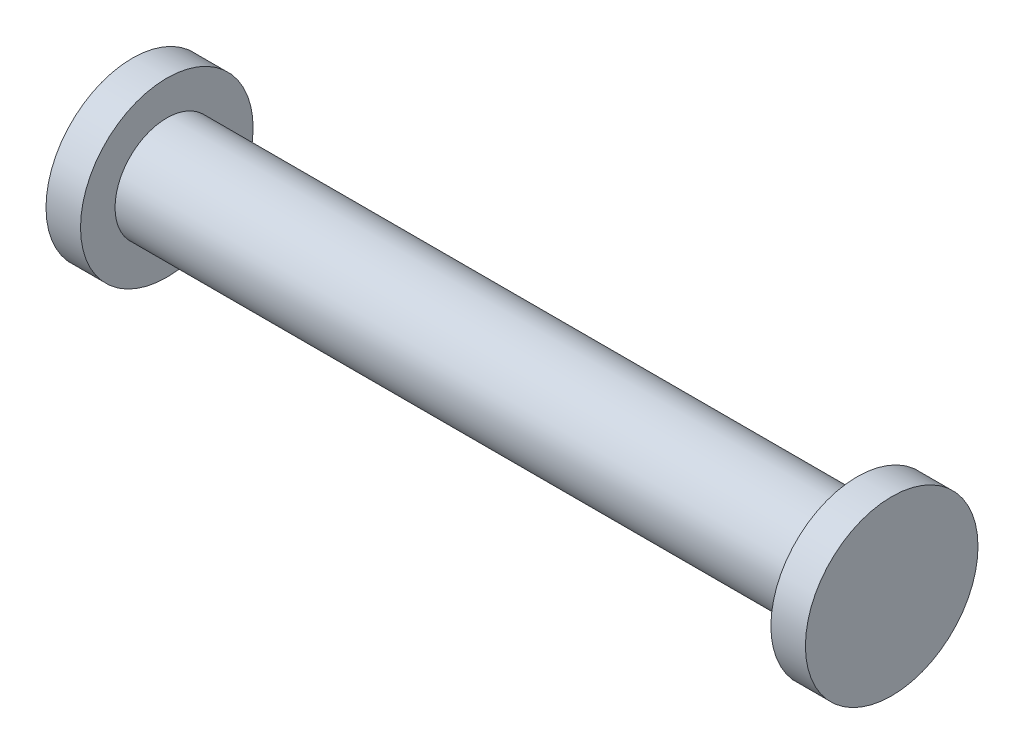
ISO-10303-21;
HEADER;
FILE_DESCRIPTION(('STEP AP214'),'2;1');
FILE_NAME('part.step','',(''),(''),'','','');
FILE_SCHEMA(('AUTOMOTIVE_DESIGN { 1 0 10303 214 1 1 1 1 }'));
ENDSEC;
DATA;
#1=APPLICATION_CONTEXT('core data for automotive mechanical design processes');
#2=APPLICATION_PROTOCOL_DEFINITION('international standard','automotive_design',2000,#1);
#3=PRODUCT_CONTEXT('',#1,'mechanical');
#4=PRODUCT('Part','Part','',(#3));
#5=PRODUCT_RELATED_PRODUCT_CATEGORY('part','',(#4));
#6=PRODUCT_DEFINITION_FORMATION('','',#4);
#7=PRODUCT_DEFINITION_CONTEXT('part definition',#1,'design');
#8=PRODUCT_DEFINITION('design','',#6,#7);
#9=PRODUCT_DEFINITION_SHAPE('','',#8);
#10=(LENGTH_UNIT() NAMED_UNIT(*) SI_UNIT(.MILLI.,.METRE.));
#11=(NAMED_UNIT(*) PLANE_ANGLE_UNIT() SI_UNIT($,.RADIAN.));
#12=(NAMED_UNIT(*) SI_UNIT($,.STERADIAN.) SOLID_ANGLE_UNIT());
#13=UNCERTAINTY_MEASURE_WITH_UNIT(LENGTH_MEASURE(1.E-05),#10,'distance_accuracy_value','');
#14=(GEOMETRIC_REPRESENTATION_CONTEXT(3) GLOBAL_UNCERTAINTY_ASSIGNED_CONTEXT((#13)) GLOBAL_UNIT_ASSIGNED_CONTEXT((#10,
#11,#12)) REPRESENTATION_CONTEXT('',''));
#15=CARTESIAN_POINT('',(0.,0.,0.));
#16=DIRECTION('',(0.,0.,1.));
#17=DIRECTION('',(1.,0.,0.));
#18=AXIS2_PLACEMENT_3D('',#15,#16,#17);
#19=CARTESIAN_POINT('',(69.85,0.,0.));
#20=DIRECTION('',(-1.,0.,0.));
#21=DIRECTION('',(0.,0.,1.));
#22=AXIS2_PLACEMENT_3D('',#19,#20,#21);
#23=PLANE('',#22);
#24=CARTESIAN_POINT('',(69.85,0.,0.));
#25=DIRECTION('',(-1.,0.,0.));
#26=DIRECTION('',(0.,0.,1.));
#27=AXIS2_PLACEMENT_3D('',#24,#25,#26);
#28=CIRCLE('',#27,7.9375);
#29=CARTESIAN_POINT('',(69.85,0.,7.9375));
#30=VERTEX_POINT('',#29);
#31=EDGE_CURVE('E10',#30,#30,#28,.T.);
#32=ORIENTED_EDGE('',*,*,#31,.F.);
#33=EDGE_LOOP('',(#32));
#34=FACE_BOUND('',#33,.T.);
#35=ADVANCED_FACE('F39',(#34),#23,.F.);
#36=CARTESIAN_POINT('',(0.,0.,0.));
#37=DIRECTION('',(-1.,0.,0.));
#38=DIRECTION('',(0.,0.,1.));
#39=AXIS2_PLACEMENT_3D('',#36,#37,#38);
#40=CYLINDRICAL_SURFACE('',#39,7.9375);
#41=CARTESIAN_POINT('',(66.675,0.,0.));
#42=DIRECTION('',(-1.,0.,0.));
#43=DIRECTION('',(0.,0.,1.));
#44=AXIS2_PLACEMENT_3D('',#41,#42,#43);
#45=CIRCLE('',#44,7.9375);
#46=CARTESIAN_POINT('',(66.675,0.,7.9375));
#47=VERTEX_POINT('',#46);
#48=EDGE_CURVE('E46',#47,#47,#45,.T.);
#49=ORIENTED_EDGE('',*,*,#48,.F.);
#50=EDGE_LOOP('',(#49));
#51=FACE_BOUND('',#50,.T.);
#52=ORIENTED_EDGE('',*,*,#31,.T.);
#53=EDGE_LOOP('',(#52));
#54=FACE_BOUND('',#53,.T.);
#55=ADVANCED_FACE('F87',(#51,#54),#40,.T.);
#56=CARTESIAN_POINT('',(66.675,0.,0.));
#57=DIRECTION('',(-1.,0.,0.));
#58=DIRECTION('',(0.,0.,1.));
#59=AXIS2_PLACEMENT_3D('',#56,#57,#58);
#60=PLANE('',#59);
#61=ORIENTED_EDGE('',*,*,#48,.T.);
#62=EDGE_LOOP('',(#61));
#63=FACE_BOUND('',#62,.T.);
#64=CARTESIAN_POINT('',(66.675,0.,0.));
#65=DIRECTION('',(-1.,0.,0.));
#66=DIRECTION('',(0.,0.,1.));
#67=AXIS2_PLACEMENT_3D('',#64,#65,#66);
#68=CIRCLE('',#67,4.7625);
#69=CARTESIAN_POINT('',(66.675,0.,4.7625));
#70=VERTEX_POINT('',#69);
#71=EDGE_CURVE('E51',#70,#70,#68,.T.);
#72=ORIENTED_EDGE('',*,*,#71,.F.);
#73=EDGE_LOOP('',(#72));
#74=FACE_BOUND('',#73,.T.);
#75=ADVANCED_FACE('F92',(#63,#74),#60,.T.);
#76=CARTESIAN_POINT('',(0.,0.,0.));
#77=DIRECTION('',(-1.,0.,0.));
#78=DIRECTION('',(0.,0.,1.));
#79=AXIS2_PLACEMENT_3D('',#76,#77,#78);
#80=CYLINDRICAL_SURFACE('',#79,4.7625);
#81=ORIENTED_EDGE('',*,*,#71,.T.);
#82=EDGE_LOOP('',(#81));
#83=FACE_BOUND('',#82,.T.);
#84=CARTESIAN_POINT('',(3.175,0.,0.));
#85=DIRECTION('',(-1.,0.,0.));
#86=DIRECTION('',(0.,0.,1.));
#87=AXIS2_PLACEMENT_3D('',#84,#85,#86);
#88=CIRCLE('',#87,4.7625);
#89=CARTESIAN_POINT('',(3.175,0.,4.7625));
#90=VERTEX_POINT('',#89);
#91=EDGE_CURVE('E56',#90,#90,#88,.T.);
#92=ORIENTED_EDGE('',*,*,#91,.F.);
#93=EDGE_LOOP('',(#92));
#94=FACE_BOUND('',#93,.T.);
#95=ADVANCED_FACE('F83',(#83,#94),#80,.T.);
#96=CARTESIAN_POINT('',(3.175,0.,0.));
#97=DIRECTION('',(-1.,0.,0.));
#98=DIRECTION('',(0.,0.,1.));
#99=AXIS2_PLACEMENT_3D('',#96,#97,#98);
#100=PLANE('',#99);
#101=CARTESIAN_POINT('',(3.175,0.,0.));
#102=DIRECTION('',(-1.,0.,0.));
#103=DIRECTION('',(0.,0.,1.));
#104=AXIS2_PLACEMENT_3D('',#101,#102,#103);
#105=CIRCLE('',#104,7.9375);
#106=CARTESIAN_POINT('',(3.175,0.,7.9375));
#107=VERTEX_POINT('',#106);
#108=EDGE_CURVE('E62',#107,#107,#105,.T.);
#109=ORIENTED_EDGE('',*,*,#108,.F.);
#110=EDGE_LOOP('',(#109));
#111=FACE_BOUND('',#110,.T.);
#112=ORIENTED_EDGE('',*,*,#91,.T.);
#113=EDGE_LOOP('',(#112));
#114=FACE_BOUND('',#113,.T.);
#115=ADVANCED_FACE('F75',(#111,#114),#100,.F.);
#116=CARTESIAN_POINT('',(0.,0.,0.));
#117=DIRECTION('',(-1.,0.,0.));
#118=DIRECTION('',(0.,0.,1.));
#119=AXIS2_PLACEMENT_3D('',#116,#117,#118);
#120=CYLINDRICAL_SURFACE('',#119,7.9375);
#121=ORIENTED_EDGE('',*,*,#108,.T.);
#122=EDGE_LOOP('',(#121));
#123=FACE_BOUND('',#122,.T.);
#124=CARTESIAN_POINT('',(0.,0.,0.));
#125=DIRECTION('',(-1.,0.,0.));
#126=DIRECTION('',(0.,0.,1.));
#127=AXIS2_PLACEMENT_3D('',#124,#125,#126);
#128=CIRCLE('',#127,7.9375);
#129=CARTESIAN_POINT('',(0.,0.,7.9375));
#130=VERTEX_POINT('',#129);
#131=EDGE_CURVE('E66',#130,#130,#128,.T.);
#132=ORIENTED_EDGE('',*,*,#131,.F.);
#133=EDGE_LOOP('',(#132));
#134=FACE_BOUND('',#133,.T.);
#135=ADVANCED_FACE('F73',(#123,#134),#120,.T.);
#136=CARTESIAN_POINT('',(0.,0.,0.));
#137=DIRECTION('',(-1.,0.,0.));
#138=DIRECTION('',(0.,0.,1.));
#139=AXIS2_PLACEMENT_3D('',#136,#137,#138);
#140=PLANE('',#139);
#141=ORIENTED_EDGE('',*,*,#131,.T.);
#142=EDGE_LOOP('',(#141));
#143=FACE_BOUND('',#142,.T.);
#144=ADVANCED_FACE('F71',(#143),#140,.T.);
#145=CLOSED_SHELL('',(#35,#55,#75,#95,#115,#135,#144));
#146=MANIFOLD_SOLID_BREP('B2',#145);
#147=ADVANCED_BREP_SHAPE_REPRESENTATION('',(#18,#146),#14);
#148=SHAPE_DEFINITION_REPRESENTATION(#9,#147);
ENDSEC;
END-ISO-10303-21;
